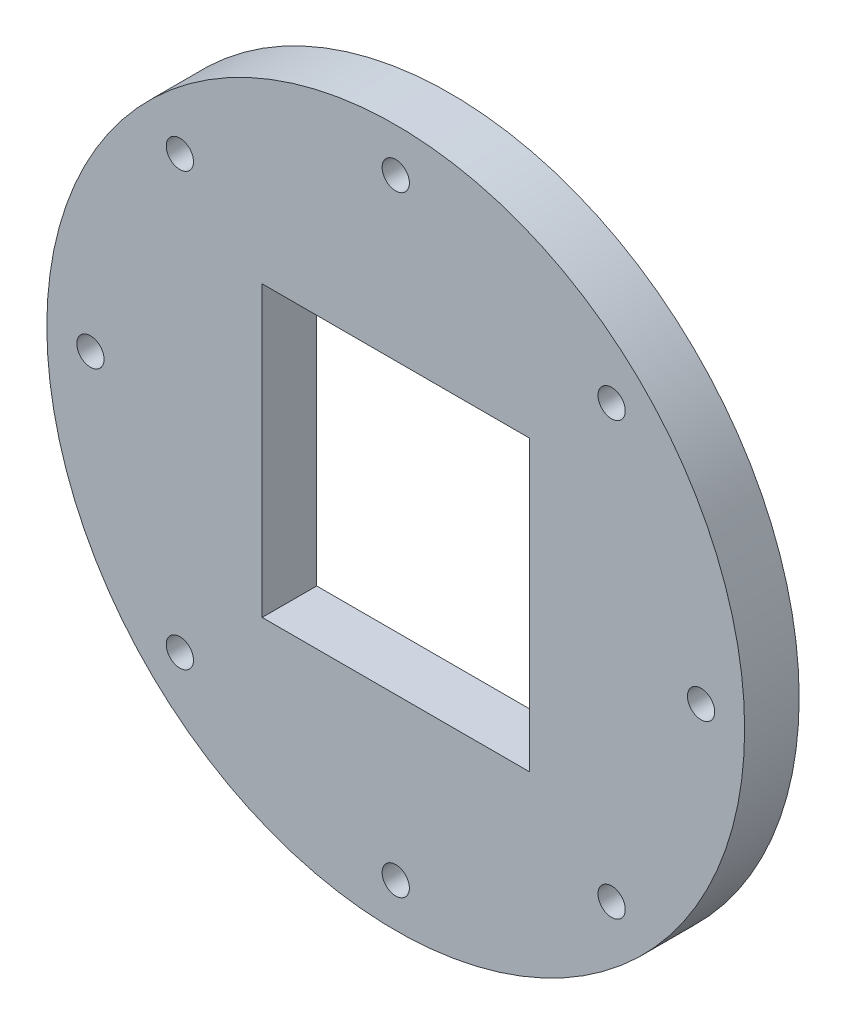
ISO-10303-21;
HEADER;
FILE_DESCRIPTION(('STEP AP214'),'2;1');
FILE_NAME('part.step','',(''),(''),'','','');
FILE_SCHEMA(('AUTOMOTIVE_DESIGN { 1 0 10303 214 1 1 1 1 }'));
ENDSEC;
DATA;
#1=APPLICATION_CONTEXT('core data for automotive mechanical design processes');
#2=APPLICATION_PROTOCOL_DEFINITION('international standard','automotive_design',2000,#1);
#3=PRODUCT_CONTEXT('',#1,'mechanical');
#4=PRODUCT('Part','Part','',(#3));
#5=PRODUCT_RELATED_PRODUCT_CATEGORY('part','',(#4));
#6=PRODUCT_DEFINITION_FORMATION('','',#4);
#7=PRODUCT_DEFINITION_CONTEXT('part definition',#1,'design');
#8=PRODUCT_DEFINITION('design','',#6,#7);
#9=PRODUCT_DEFINITION_SHAPE('','',#8);
#10=(LENGTH_UNIT() NAMED_UNIT(*) SI_UNIT(.MILLI.,.METRE.));
#11=(NAMED_UNIT(*) PLANE_ANGLE_UNIT() SI_UNIT($,.RADIAN.));
#12=(NAMED_UNIT(*) SI_UNIT($,.STERADIAN.) SOLID_ANGLE_UNIT());
#13=UNCERTAINTY_MEASURE_WITH_UNIT(LENGTH_MEASURE(1.E-05),#10,'distance_accuracy_value','');
#14=(GEOMETRIC_REPRESENTATION_CONTEXT(3) GLOBAL_UNCERTAINTY_ASSIGNED_CONTEXT((#13)) GLOBAL_UNIT_ASSIGNED_CONTEXT((#10,
#11,#12)) REPRESENTATION_CONTEXT('',''));
#15=CARTESIAN_POINT('',(0.,0.,0.));
#16=DIRECTION('',(0.,0.,1.));
#17=DIRECTION('',(1.,0.,0.));
#18=AXIS2_PLACEMENT_3D('',#15,#16,#17);
#19=CARTESIAN_POINT('',(0.,0.,5.));
#20=DIRECTION('',(0.,0.,-1.));
#21=DIRECTION('',(-1.,0.,0.));
#22=AXIS2_PLACEMENT_3D('',#19,#20,#21);
#23=CYLINDRICAL_SURFACE('',#22,32.);
#24=CARTESIAN_POINT('',(0.,0.,5.));
#25=DIRECTION('',(0.,0.,1.));
#26=DIRECTION('',(1.,0.,0.));
#27=AXIS2_PLACEMENT_3D('',#24,#25,#26);
#28=CIRCLE('',#27,32.);
#29=CARTESIAN_POINT('',(32.,0.,5.));
#30=VERTEX_POINT('',#29);
#31=EDGE_CURVE('E179',#30,#30,#28,.T.);
#32=ORIENTED_EDGE('',*,*,#31,.F.);
#33=EDGE_LOOP('',(#32));
#34=FACE_BOUND('',#33,.T.);
#35=CARTESIAN_POINT('',(0.,0.,0.));
#36=DIRECTION('',(0.,0.,1.));
#37=DIRECTION('',(1.,0.,0.));
#38=AXIS2_PLACEMENT_3D('',#35,#36,#37);
#39=CIRCLE('',#38,32.);
#40=CARTESIAN_POINT('',(32.,0.,0.));
#41=VERTEX_POINT('',#40);
#42=EDGE_CURVE('E119',#41,#41,#39,.T.);
#43=ORIENTED_EDGE('',*,*,#42,.T.);
#44=EDGE_LOOP('',(#43));
#45=FACE_BOUND('',#44,.T.);
#46=ADVANCED_FACE('F38',(#34,#45),#23,.T.);
#47=CARTESIAN_POINT('',(0.,0.,5.));
#48=DIRECTION('',(0.,0.,1.));
#49=DIRECTION('',(1.,0.,0.));
#50=AXIS2_PLACEMENT_3D('',#47,#48,#49);
#51=PLANE('',#50);
#52=DIRECTION('',(-1.,0.,0.));
#53=VECTOR('',#52,1.);
#54=CARTESIAN_POINT('',(-12.2499999999999,13.2500000000001,5.));
#55=LINE('',#54,#53);
#56=CARTESIAN_POINT('',(12.2500000000001,13.2499999999999,5.));
#57=VERTEX_POINT('',#56);
#58=CARTESIAN_POINT('',(-12.2499999999999,13.2500000000001,5.));
#59=VERTEX_POINT('',#58);
#60=EDGE_CURVE('E53',#57,#59,#55,.T.);
#61=ORIENTED_EDGE('',*,*,#60,.F.);
#62=DIRECTION('',(0.,1.,0.));
#63=VECTOR('',#62,1.);
#64=CARTESIAN_POINT('',(12.2499999999999,-13.2500000000001,5.));
#65=LINE('',#64,#63);
#66=CARTESIAN_POINT('',(12.2499999999999,-13.2500000000001,5.));
#67=VERTEX_POINT('',#66);
#68=EDGE_CURVE('E100',#67,#57,#65,.T.);
#69=ORIENTED_EDGE('',*,*,#68,.F.);
#70=DIRECTION('',(1.,0.,0.));
#71=VECTOR('',#70,1.);
#72=CARTESIAN_POINT('',(-12.2500000000001,-13.2499999999999,5.));
#73=LINE('',#72,#71);
#74=CARTESIAN_POINT('',(-12.2500000000001,-13.2499999999999,5.));
#75=VERTEX_POINT('',#74);
#76=EDGE_CURVE('E82',#75,#67,#73,.T.);
#77=ORIENTED_EDGE('',*,*,#76,.F.);
#78=DIRECTION('',(0.,-1.,0.));
#79=VECTOR('',#78,1.);
#80=CARTESIAN_POINT('',(-12.2500000000001,-13.2499999999999,5.));
#81=LINE('',#80,#79);
#82=EDGE_CURVE('E92',#59,#75,#81,.T.);
#83=ORIENTED_EDGE('',*,*,#82,.F.);
#84=EDGE_LOOP('',(#61,#69,#77,#83));
#85=FACE_BOUND('',#84,.T.);
#86=CARTESIAN_POINT('',(0.,28.,5.));
#87=DIRECTION('',(0.,0.,1.));
#88=DIRECTION('',(1.,0.,0.));
#89=AXIS2_PLACEMENT_3D('',#86,#87,#88);
#90=CIRCLE('',#89,1.25);
#91=CARTESIAN_POINT('',(1.25,28.,5.));
#92=VERTEX_POINT('',#91);
#93=EDGE_CURVE('E120',#92,#92,#90,.T.);
#94=ORIENTED_EDGE('',*,*,#93,.F.);
#95=EDGE_LOOP('',(#94));
#96=FACE_BOUND('',#95,.T.);
#97=CARTESIAN_POINT('',(-19.7989898732231,19.7989898732236,5.));
#98=DIRECTION('',(0.,0.,1.));
#99=DIRECTION('',(1.,0.,0.));
#100=AXIS2_PLACEMENT_3D('',#97,#98,#99);
#101=CIRCLE('',#100,1.25);
#102=CARTESIAN_POINT('',(-18.5489898732231,19.7989898732236,5.));
#103=VERTEX_POINT('',#102);
#104=EDGE_CURVE('E110',#103,#103,#101,.T.);
#105=ORIENTED_EDGE('',*,*,#104,.F.);
#106=EDGE_LOOP('',(#105));
#107=FACE_BOUND('',#106,.T.);
#108=CARTESIAN_POINT('',(-19.7989898732235,-19.7989898732232,5.));
#109=DIRECTION('',(0.,0.,1.));
#110=DIRECTION('',(1.,0.,0.));
#111=AXIS2_PLACEMENT_3D('',#108,#109,#110);
#112=CIRCLE('',#111,1.25);
#113=CARTESIAN_POINT('',(-18.5489898732235,-19.7989898732232,5.));
#114=VERTEX_POINT('',#113);
#115=EDGE_CURVE('E138',#114,#114,#112,.T.);
#116=ORIENTED_EDGE('',*,*,#115,.F.);
#117=EDGE_LOOP('',(#116));
#118=FACE_BOUND('',#117,.T.);
#119=CARTESIAN_POINT('',(-1.90819582357449E-13,-28.,5.));
#120=DIRECTION('',(0.,0.,1.));
#121=DIRECTION('',(1.,0.,0.));
#122=AXIS2_PLACEMENT_3D('',#119,#120,#121);
#123=CIRCLE('',#122,1.25);
#124=CARTESIAN_POINT('',(1.24999999999981,-28.,5.));
#125=VERTEX_POINT('',#124);
#126=EDGE_CURVE('E130',#125,#125,#123,.T.);
#127=ORIENTED_EDGE('',*,*,#126,.F.);
#128=EDGE_LOOP('',(#127));
#129=FACE_BOUND('',#128,.T.);
#130=CARTESIAN_POINT('',(-28.,2.89102075612391E-13,5.));
#131=DIRECTION('',(0.,0.,1.));
#132=DIRECTION('',(1.,0.,0.));
#133=AXIS2_PLACEMENT_3D('',#130,#131,#132);
#134=CIRCLE('',#133,1.25);
#135=CARTESIAN_POINT('',(-26.75,2.89102075612391E-13,5.));
#136=VERTEX_POINT('',#135);
#137=EDGE_CURVE('E168',#136,#136,#134,.T.);
#138=ORIENTED_EDGE('',*,*,#137,.F.);
#139=EDGE_LOOP('',(#138));
#140=FACE_BOUND('',#139,.T.);
#141=CARTESIAN_POINT('',(19.7989898732236,19.798989873223,5.));
#142=DIRECTION('',(0.,0.,1.));
#143=DIRECTION('',(1.,0.,0.));
#144=AXIS2_PLACEMENT_3D('',#141,#142,#143);
#145=CIRCLE('',#144,1.25);
#146=CARTESIAN_POINT('',(21.0489898732236,19.798989873223,5.));
#147=VERTEX_POINT('',#146);
#148=EDGE_CURVE('E153',#147,#147,#145,.T.);
#149=ORIENTED_EDGE('',*,*,#148,.F.);
#150=EDGE_LOOP('',(#149));
#151=FACE_BOUND('',#150,.T.);
#152=CARTESIAN_POINT('',(28.,-4.83987849797529E-13,5.));
#153=DIRECTION('',(0.,0.,1.));
#154=DIRECTION('',(1.,0.,0.));
#155=AXIS2_PLACEMENT_3D('',#152,#153,#154);
#156=CIRCLE('',#155,1.25);
#157=CARTESIAN_POINT('',(29.25,-4.83987849797529E-13,5.));
#158=VERTEX_POINT('',#157);
#159=EDGE_CURVE('E154',#158,#158,#156,.T.);
#160=ORIENTED_EDGE('',*,*,#159,.F.);
#161=EDGE_LOOP('',(#160));
#162=FACE_BOUND('',#161,.T.);
#163=CARTESIAN_POINT('',(19.7989898732232,-19.7989898732234,5.));
#164=DIRECTION('',(0.,0.,1.));
#165=DIRECTION('',(1.,0.,0.));
#166=AXIS2_PLACEMENT_3D('',#163,#164,#165);
#167=CIRCLE('',#166,1.25);
#168=CARTESIAN_POINT('',(21.0489898732232,-19.7989898732234,5.));
#169=VERTEX_POINT('',#168);
#170=EDGE_CURVE('E129',#169,#169,#167,.T.);
#171=ORIENTED_EDGE('',*,*,#170,.F.);
#172=EDGE_LOOP('',(#171));
#173=FACE_BOUND('',#172,.T.);
#174=ORIENTED_EDGE('',*,*,#31,.T.);
#175=EDGE_LOOP('',(#174));
#176=FACE_BOUND('',#175,.T.);
#177=ADVANCED_FACE('F97',(#85,#96,#107,#118,#129,#140,#151,#162,#173,#176),#51,.T.);
#178=CARTESIAN_POINT('',(0.,0.,0.));
#179=DIRECTION('',(0.,0.,1.));
#180=DIRECTION('',(1.,0.,0.));
#181=AXIS2_PLACEMENT_3D('',#178,#179,#180);
#182=PLANE('',#181);
#183=DIRECTION('',(0.,1.,0.));
#184=VECTOR('',#183,1.);
#185=CARTESIAN_POINT('',(12.25,0.,0.));
#186=LINE('',#185,#184);
#187=CARTESIAN_POINT('',(12.2499999999999,-13.2500000000001,0.));
#188=VERTEX_POINT('',#187);
#189=CARTESIAN_POINT('',(12.2500000000001,13.2499999999999,0.));
#190=VERTEX_POINT('',#189);
#191=EDGE_CURVE('E46',#188,#190,#186,.T.);
#192=ORIENTED_EDGE('',*,*,#191,.T.);
#193=DIRECTION('',(-1.,0.,0.));
#194=VECTOR('',#193,1.);
#195=CARTESIAN_POINT('',(0.,13.25,0.));
#196=LINE('',#195,#194);
#197=CARTESIAN_POINT('',(-12.2499999999999,13.2500000000001,0.));
#198=VERTEX_POINT('',#197);
#199=EDGE_CURVE('E11',#190,#198,#196,.T.);
#200=ORIENTED_EDGE('',*,*,#199,.T.);
#201=DIRECTION('',(0.,-1.,0.));
#202=VECTOR('',#201,1.);
#203=CARTESIAN_POINT('',(-12.25,0.,0.));
#204=LINE('',#203,#202);
#205=CARTESIAN_POINT('',(-12.2500000000001,-13.2499999999999,0.));
#206=VERTEX_POINT('',#205);
#207=EDGE_CURVE('E183',#198,#206,#204,.T.);
#208=ORIENTED_EDGE('',*,*,#207,.T.);
#209=DIRECTION('',(1.,0.,0.));
#210=VECTOR('',#209,1.);
#211=CARTESIAN_POINT('',(0.,-13.25,0.));
#212=LINE('',#211,#210);
#213=EDGE_CURVE('E85',#206,#188,#212,.T.);
#214=ORIENTED_EDGE('',*,*,#213,.T.);
#215=EDGE_LOOP('',(#192,#200,#208,#214));
#216=FACE_BOUND('',#215,.T.);
#217=CARTESIAN_POINT('',(0.,28.,0.));
#218=DIRECTION('',(0.,0.,1.));
#219=DIRECTION('',(1.,0.,0.));
#220=AXIS2_PLACEMENT_3D('',#217,#218,#219);
#221=CIRCLE('',#220,1.25);
#222=CARTESIAN_POINT('',(1.25,28.,0.));
#223=VERTEX_POINT('',#222);
#224=EDGE_CURVE('E115',#223,#223,#221,.T.);
#225=ORIENTED_EDGE('',*,*,#224,.T.);
#226=EDGE_LOOP('',(#225));
#227=FACE_BOUND('',#226,.T.);
#228=CARTESIAN_POINT('',(-19.7989898732231,19.7989898732236,0.));
#229=DIRECTION('',(0.,0.,1.));
#230=DIRECTION('',(1.,0.,0.));
#231=AXIS2_PLACEMENT_3D('',#228,#229,#230);
#232=CIRCLE('',#231,1.25);
#233=CARTESIAN_POINT('',(-18.5489898732231,19.7989898732236,0.));
#234=VERTEX_POINT('',#233);
#235=EDGE_CURVE('E142',#234,#234,#232,.T.);
#236=ORIENTED_EDGE('',*,*,#235,.T.);
#237=EDGE_LOOP('',(#236));
#238=FACE_BOUND('',#237,.T.);
#239=CARTESIAN_POINT('',(-19.7989898732235,-19.7989898732232,0.));
#240=DIRECTION('',(0.,0.,1.));
#241=DIRECTION('',(1.,0.,0.));
#242=AXIS2_PLACEMENT_3D('',#239,#240,#241);
#243=CIRCLE('',#242,1.25);
#244=CARTESIAN_POINT('',(-18.5489898732235,-19.7989898732232,0.));
#245=VERTEX_POINT('',#244);
#246=EDGE_CURVE('E134',#245,#245,#243,.T.);
#247=ORIENTED_EDGE('',*,*,#246,.T.);
#248=EDGE_LOOP('',(#247));
#249=FACE_BOUND('',#248,.T.);
#250=CARTESIAN_POINT('',(-1.90819582357449E-13,-28.,0.));
#251=DIRECTION('',(0.,0.,1.));
#252=DIRECTION('',(1.,0.,0.));
#253=AXIS2_PLACEMENT_3D('',#250,#251,#252);
#254=CIRCLE('',#253,1.25);
#255=CARTESIAN_POINT('',(1.24999999999981,-28.,0.));
#256=VERTEX_POINT('',#255);
#257=EDGE_CURVE('E125',#256,#256,#254,.T.);
#258=ORIENTED_EDGE('',*,*,#257,.T.);
#259=EDGE_LOOP('',(#258));
#260=FACE_BOUND('',#259,.T.);
#261=CARTESIAN_POINT('',(-28.,2.89102075612391E-13,0.));
#262=DIRECTION('',(0.,0.,1.));
#263=DIRECTION('',(1.,0.,0.));
#264=AXIS2_PLACEMENT_3D('',#261,#262,#263);
#265=CIRCLE('',#264,1.25);
#266=CARTESIAN_POINT('',(-26.75,2.89102075612391E-13,0.));
#267=VERTEX_POINT('',#266);
#268=EDGE_CURVE('E124',#267,#267,#265,.T.);
#269=ORIENTED_EDGE('',*,*,#268,.T.);
#270=EDGE_LOOP('',(#269));
#271=FACE_BOUND('',#270,.T.);
#272=CARTESIAN_POINT('',(19.7989898732236,19.798989873223,0.));
#273=DIRECTION('',(0.,0.,1.));
#274=DIRECTION('',(1.,0.,0.));
#275=AXIS2_PLACEMENT_3D('',#272,#273,#274);
#276=CIRCLE('',#275,1.25);
#277=CARTESIAN_POINT('',(21.0489898732236,19.798989873223,0.));
#278=VERTEX_POINT('',#277);
#279=EDGE_CURVE('E172',#278,#278,#276,.T.);
#280=ORIENTED_EDGE('',*,*,#279,.T.);
#281=EDGE_LOOP('',(#280));
#282=FACE_BOUND('',#281,.T.);
#283=CARTESIAN_POINT('',(28.,-4.83987849797529E-13,0.));
#284=DIRECTION('',(0.,0.,1.));
#285=DIRECTION('',(1.,0.,0.));
#286=AXIS2_PLACEMENT_3D('',#283,#284,#285);
#287=CIRCLE('',#286,1.25);
#288=CARTESIAN_POINT('',(29.25,-4.83987849797529E-13,0.));
#289=VERTEX_POINT('',#288);
#290=EDGE_CURVE('E149',#289,#289,#287,.T.);
#291=ORIENTED_EDGE('',*,*,#290,.T.);
#292=EDGE_LOOP('',(#291));
#293=FACE_BOUND('',#292,.T.);
#294=CARTESIAN_POINT('',(19.7989898732232,-19.7989898732234,0.));
#295=DIRECTION('',(0.,0.,1.));
#296=DIRECTION('',(1.,0.,0.));
#297=AXIS2_PLACEMENT_3D('',#294,#295,#296);
#298=CIRCLE('',#297,1.25);
#299=CARTESIAN_POINT('',(21.0489898732232,-19.7989898732234,0.));
#300=VERTEX_POINT('',#299);
#301=EDGE_CURVE('E158',#300,#300,#298,.T.);
#302=ORIENTED_EDGE('',*,*,#301,.T.);
#303=EDGE_LOOP('',(#302));
#304=FACE_BOUND('',#303,.T.);
#305=ORIENTED_EDGE('',*,*,#42,.F.);
#306=EDGE_LOOP('',(#305));
#307=FACE_BOUND('',#306,.T.);
#308=ADVANCED_FACE('F193',(#216,#227,#238,#249,#260,#271,#282,#293,#304,#307),#182,.F.);
#309=CARTESIAN_POINT('',(19.7989898732232,-19.7989898732234,0.));
#310=DIRECTION('',(0.,0.,1.));
#311=DIRECTION('',(1.,0.,0.));
#312=AXIS2_PLACEMENT_3D('',#309,#310,#311);
#313=CYLINDRICAL_SURFACE('',#312,1.25);
#314=ORIENTED_EDGE('',*,*,#301,.F.);
#315=EDGE_LOOP('',(#314));
#316=FACE_BOUND('',#315,.T.);
#317=ORIENTED_EDGE('',*,*,#170,.T.);
#318=EDGE_LOOP('',(#317));
#319=FACE_BOUND('',#318,.T.);
#320=ADVANCED_FACE('F223',(#316,#319),#313,.F.);
#321=CARTESIAN_POINT('',(28.,-4.83987849797529E-13,0.));
#322=DIRECTION('',(0.,0.,1.));
#323=DIRECTION('',(1.,0.,0.));
#324=AXIS2_PLACEMENT_3D('',#321,#322,#323);
#325=CYLINDRICAL_SURFACE('',#324,1.25);
#326=ORIENTED_EDGE('',*,*,#290,.F.);
#327=EDGE_LOOP('',(#326));
#328=FACE_BOUND('',#327,.T.);
#329=ORIENTED_EDGE('',*,*,#159,.T.);
#330=EDGE_LOOP('',(#329));
#331=FACE_BOUND('',#330,.T.);
#332=ADVANCED_FACE('F227',(#328,#331),#325,.F.);
#333=CARTESIAN_POINT('',(19.7989898732236,19.798989873223,0.));
#334=DIRECTION('',(0.,0.,1.));
#335=DIRECTION('',(1.,0.,0.));
#336=AXIS2_PLACEMENT_3D('',#333,#334,#335);
#337=CYLINDRICAL_SURFACE('',#336,1.25);
#338=ORIENTED_EDGE('',*,*,#279,.F.);
#339=EDGE_LOOP('',(#338));
#340=FACE_BOUND('',#339,.T.);
#341=ORIENTED_EDGE('',*,*,#148,.T.);
#342=EDGE_LOOP('',(#341));
#343=FACE_BOUND('',#342,.T.);
#344=ADVANCED_FACE('F231',(#340,#343),#337,.F.);
#345=CARTESIAN_POINT('',(-28.,2.89102075612391E-13,0.));
#346=DIRECTION('',(0.,0.,1.));
#347=DIRECTION('',(1.,0.,0.));
#348=AXIS2_PLACEMENT_3D('',#345,#346,#347);
#349=CYLINDRICAL_SURFACE('',#348,1.25);
#350=ORIENTED_EDGE('',*,*,#268,.F.);
#351=EDGE_LOOP('',(#350));
#352=FACE_BOUND('',#351,.T.);
#353=ORIENTED_EDGE('',*,*,#137,.T.);
#354=EDGE_LOOP('',(#353));
#355=FACE_BOUND('',#354,.T.);
#356=ADVANCED_FACE('F234',(#352,#355),#349,.F.);
#357=CARTESIAN_POINT('',(-1.90819582357449E-13,-28.,0.));
#358=DIRECTION('',(0.,0.,1.));
#359=DIRECTION('',(1.,0.,0.));
#360=AXIS2_PLACEMENT_3D('',#357,#358,#359);
#361=CYLINDRICAL_SURFACE('',#360,1.25);
#362=ORIENTED_EDGE('',*,*,#257,.F.);
#363=EDGE_LOOP('',(#362));
#364=FACE_BOUND('',#363,.T.);
#365=ORIENTED_EDGE('',*,*,#126,.T.);
#366=EDGE_LOOP('',(#365));
#367=FACE_BOUND('',#366,.T.);
#368=ADVANCED_FACE('F237',(#364,#367),#361,.F.);
#369=CARTESIAN_POINT('',(-19.7989898732235,-19.7989898732232,0.));
#370=DIRECTION('',(0.,0.,1.));
#371=DIRECTION('',(1.,0.,0.));
#372=AXIS2_PLACEMENT_3D('',#369,#370,#371);
#373=CYLINDRICAL_SURFACE('',#372,1.25);
#374=ORIENTED_EDGE('',*,*,#246,.F.);
#375=EDGE_LOOP('',(#374));
#376=FACE_BOUND('',#375,.T.);
#377=ORIENTED_EDGE('',*,*,#115,.T.);
#378=EDGE_LOOP('',(#377));
#379=FACE_BOUND('',#378,.T.);
#380=ADVANCED_FACE('F245',(#376,#379),#373,.F.);
#381=CARTESIAN_POINT('',(-19.7989898732231,19.7989898732236,0.));
#382=DIRECTION('',(0.,0.,1.));
#383=DIRECTION('',(1.,0.,0.));
#384=AXIS2_PLACEMENT_3D('',#381,#382,#383);
#385=CYLINDRICAL_SURFACE('',#384,1.25);
#386=ORIENTED_EDGE('',*,*,#235,.F.);
#387=EDGE_LOOP('',(#386));
#388=FACE_BOUND('',#387,.T.);
#389=ORIENTED_EDGE('',*,*,#104,.T.);
#390=EDGE_LOOP('',(#389));
#391=FACE_BOUND('',#390,.T.);
#392=ADVANCED_FACE('F207',(#388,#391),#385,.F.);
#393=CARTESIAN_POINT('',(0.,28.,0.));
#394=DIRECTION('',(0.,0.,1.));
#395=DIRECTION('',(1.,0.,0.));
#396=AXIS2_PLACEMENT_3D('',#393,#394,#395);
#397=CYLINDRICAL_SURFACE('',#396,1.25);
#398=ORIENTED_EDGE('',*,*,#224,.F.);
#399=EDGE_LOOP('',(#398));
#400=FACE_BOUND('',#399,.T.);
#401=ORIENTED_EDGE('',*,*,#93,.T.);
#402=EDGE_LOOP('',(#401));
#403=FACE_BOUND('',#402,.T.);
#404=ADVANCED_FACE('F200',(#400,#403),#397,.F.);
#405=CARTESIAN_POINT('',(-12.2499999999999,13.2500000000001,-5.));
#406=DIRECTION('',(0.,1.,0.));
#407=DIRECTION('',(-1.,0.,0.));
#408=AXIS2_PLACEMENT_3D('',#405,#406,#407);
#409=PLANE('',#408);
#410=DIRECTION('',(0.,0.,1.));
#411=VECTOR('',#410,1.);
#412=CARTESIAN_POINT('',(12.2500000000001,13.2499999999999,-5.));
#413=LINE('',#412,#411);
#414=EDGE_CURVE('E107',#190,#57,#413,.T.);
#415=ORIENTED_EDGE('',*,*,#414,.T.);
#416=ORIENTED_EDGE('',*,*,#60,.T.);
#417=DIRECTION('',(0.,0.,1.));
#418=VECTOR('',#417,1.);
#419=CARTESIAN_POINT('',(-12.2499999999999,13.2500000000001,-5.));
#420=LINE('',#419,#418);
#421=EDGE_CURVE('E89',#198,#59,#420,.T.);
#422=ORIENTED_EDGE('',*,*,#421,.F.);
#423=ORIENTED_EDGE('',*,*,#199,.F.);
#424=EDGE_LOOP('',(#415,#416,#422,#423));
#425=FACE_BOUND('',#424,.T.);
#426=ADVANCED_FACE('F198',(#425),#409,.F.);
#427=CARTESIAN_POINT('',(12.2499999999999,-13.2500000000001,-5.));
#428=DIRECTION('',(1.,0.,0.));
#429=DIRECTION('',(0.,1.,0.));
#430=AXIS2_PLACEMENT_3D('',#427,#428,#429);
#431=PLANE('',#430);
#432=DIRECTION('',(0.,0.,1.));
#433=VECTOR('',#432,1.);
#434=CARTESIAN_POINT('',(12.2499999999999,-13.2500000000001,-5.));
#435=LINE('',#434,#433);
#436=EDGE_CURVE('E88',#188,#67,#435,.T.);
#437=ORIENTED_EDGE('',*,*,#436,.T.);
#438=ORIENTED_EDGE('',*,*,#68,.T.);
#439=ORIENTED_EDGE('',*,*,#414,.F.);
#440=ORIENTED_EDGE('',*,*,#191,.F.);
#441=EDGE_LOOP('',(#437,#438,#439,#440));
#442=FACE_BOUND('',#441,.T.);
#443=ADVANCED_FACE('F197',(#442),#431,.F.);
#444=CARTESIAN_POINT('',(-12.2500000000001,-13.2499999999999,-5.));
#445=DIRECTION('',(0.,-1.,0.));
#446=DIRECTION('',(1.,0.,0.));
#447=AXIS2_PLACEMENT_3D('',#444,#445,#446);
#448=PLANE('',#447);
#449=DIRECTION('',(0.,0.,1.));
#450=VECTOR('',#449,1.);
#451=CARTESIAN_POINT('',(-12.2500000000001,-13.2499999999999,-5.));
#452=LINE('',#451,#450);
#453=EDGE_CURVE('E61',#206,#75,#452,.T.);
#454=ORIENTED_EDGE('',*,*,#453,.T.);
#455=ORIENTED_EDGE('',*,*,#76,.T.);
#456=ORIENTED_EDGE('',*,*,#436,.F.);
#457=ORIENTED_EDGE('',*,*,#213,.F.);
#458=EDGE_LOOP('',(#454,#455,#456,#457));
#459=FACE_BOUND('',#458,.T.);
#460=ADVANCED_FACE('F79',(#459),#448,.F.);
#461=CARTESIAN_POINT('',(-12.2500000000001,-13.2499999999999,-5.));
#462=DIRECTION('',(-1.,0.,0.));
#463=DIRECTION('',(0.,-1.,0.));
#464=AXIS2_PLACEMENT_3D('',#461,#462,#463);
#465=PLANE('',#464);
#466=ORIENTED_EDGE('',*,*,#421,.T.);
#467=ORIENTED_EDGE('',*,*,#82,.T.);
#468=ORIENTED_EDGE('',*,*,#453,.F.);
#469=ORIENTED_EDGE('',*,*,#207,.F.);
#470=EDGE_LOOP('',(#466,#467,#468,#469));
#471=FACE_BOUND('',#470,.T.);
#472=ADVANCED_FACE('F93',(#471),#465,.F.);
#473=CLOSED_SHELL('',(#46,#177,#308,#320,#332,#344,#356,#368,#380,#392,#404,#426,#443,#460,#472));
#474=MANIFOLD_SOLID_BREP('B2',#473);
#475=ADVANCED_BREP_SHAPE_REPRESENTATION('',(#18,#474),#14);
#476=SHAPE_DEFINITION_REPRESENTATION(#9,#475);
ENDSEC;
END-ISO-10303-21;
